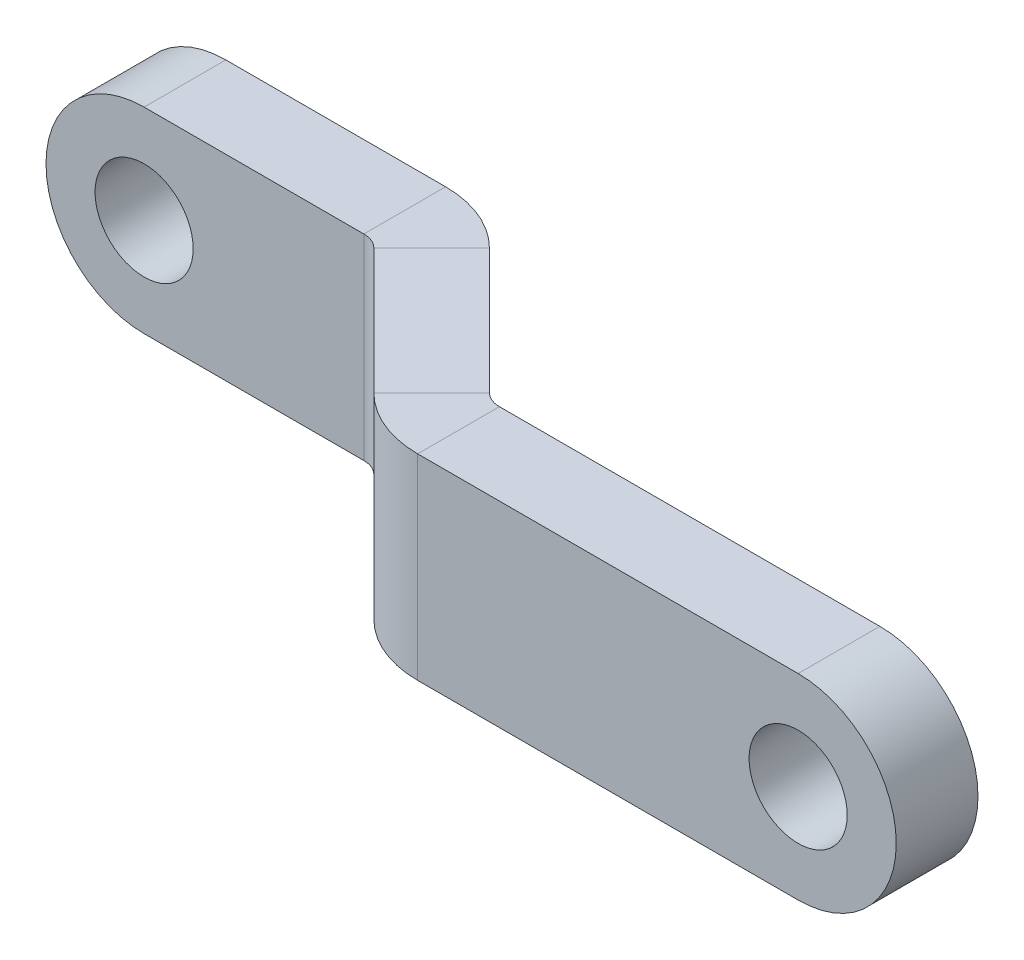
ISO-10303-21;
HEADER;
FILE_DESCRIPTION(('STEP AP214'),'2;1');
FILE_NAME('part.step','',(''),(''),'','','');
FILE_SCHEMA(('AUTOMOTIVE_DESIGN { 1 0 10303 214 1 1 1 1 }'));
ENDSEC;
DATA;
#1=APPLICATION_CONTEXT('core data for automotive mechanical design processes');
#2=APPLICATION_PROTOCOL_DEFINITION('international standard','automotive_design',2000,#1);
#3=PRODUCT_CONTEXT('',#1,'mechanical');
#4=PRODUCT('Part','Part','',(#3));
#5=PRODUCT_RELATED_PRODUCT_CATEGORY('part','',(#4));
#6=PRODUCT_DEFINITION_FORMATION('','',#4);
#7=PRODUCT_DEFINITION_CONTEXT('part definition',#1,'design');
#8=PRODUCT_DEFINITION('design','',#6,#7);
#9=PRODUCT_DEFINITION_SHAPE('','',#8);
#10=(LENGTH_UNIT() NAMED_UNIT(*) SI_UNIT(.MILLI.,.METRE.));
#11=(NAMED_UNIT(*) PLANE_ANGLE_UNIT() SI_UNIT($,.RADIAN.));
#12=(NAMED_UNIT(*) SI_UNIT($,.STERADIAN.) SOLID_ANGLE_UNIT());
#13=UNCERTAINTY_MEASURE_WITH_UNIT(LENGTH_MEASURE(1.E-05),#10,'distance_accuracy_value','');
#14=(GEOMETRIC_REPRESENTATION_CONTEXT(3) GLOBAL_UNCERTAINTY_ASSIGNED_CONTEXT((#13)) GLOBAL_UNIT_ASSIGNED_CONTEXT((#10,
#11,#12)) REPRESENTATION_CONTEXT('',''));
#15=CARTESIAN_POINT('',(0.,0.,0.));
#16=DIRECTION('',(0.,0.,1.));
#17=DIRECTION('',(1.,0.,0.));
#18=AXIS2_PLACEMENT_3D('',#15,#16,#17);
#19=CARTESIAN_POINT('',(1.38577854761114,0.,-5.63919516673022));
#20=DIRECTION('',(-0.707106781186549,0.,0.707106781186546));
#21=DIRECTION('',(0.707106781186546,0.,0.707106781186549));
#22=AXIS2_PLACEMENT_3D('',#19,#20,#21);
#23=PLANE('',#22);
#24=DIRECTION('',(0.707106781186546,0.,0.707106781186549));
#25=VECTOR('',#24,1.);
#26=CARTESIAN_POINT('',(1.38577854761114,-3.,-5.63919516673022));
#27=LINE('',#26,#25);
#28=CARTESIAN_POINT('',(7.24071885931933,-3.,0.21574514497799));
#29=VERTEX_POINT('',#28);
#30=CARTESIAN_POINT('',(11.0769955223297,-3.,4.05202180798839));
#31=VERTEX_POINT('',#30);
#32=EDGE_CURVE('E197',#29,#31,#27,.T.);
#33=ORIENTED_EDGE('',*,*,#32,.T.);
#34=DIRECTION('',(0.,1.,0.));
#35=VECTOR('',#34,1.);
#36=CARTESIAN_POINT('',(11.0769955223297,0.,4.05202180798839));
#37=LINE('',#36,#35);
#38=CARTESIAN_POINT('',(11.0769955223297,3.,4.0520218079884));
#39=VERTEX_POINT('',#38);
#40=EDGE_CURVE('E51',#31,#39,#37,.T.);
#41=ORIENTED_EDGE('',*,*,#40,.T.);
#42=DIRECTION('',(-0.707106781186546,0.,-0.707106781186549));
#43=VECTOR('',#42,1.);
#44=CARTESIAN_POINT('',(1.38577854761114,3.,-5.63919516673022));
#45=LINE('',#44,#43);
#46=CARTESIAN_POINT('',(7.24071885931932,3.,0.215745144977988));
#47=VERTEX_POINT('',#46);
#48=EDGE_CURVE('E67',#39,#47,#45,.T.);
#49=ORIENTED_EDGE('',*,*,#48,.T.);
#50=DIRECTION('',(0.,1.,0.));
#51=VECTOR('',#50,1.);
#52=CARTESIAN_POINT('',(7.24071885931933,0.,0.21574514497799));
#53=LINE('',#52,#51);
#54=EDGE_CURVE('E237',#29,#47,#53,.T.);
#55=ORIENTED_EDGE('',*,*,#54,.F.);
#56=EDGE_LOOP('',(#33,#41,#49,#55));
#57=FACE_BOUND('',#56,.T.);
#58=ADVANCED_FACE('F42',(#57),#23,.T.);
#59=CARTESIAN_POINT('',(3.15354550057751,-3.,-7.40696211969658));
#60=DIRECTION('',(0.,-1.,0.));
#61=DIRECTION('',(0.707106781186549,0.,-0.707106781186546));
#62=AXIS2_PLACEMENT_3D('',#59,#60,#61);
#63=PLANE('',#62);
#64=DIRECTION('',(0.707106781186546,0.,0.707106781186549));
#65=VECTOR('',#64,1.);
#66=CARTESIAN_POINT('',(3.15354550057751,-3.,-7.40696211969658));
#67=LINE('',#66,#65);
#68=CARTESIAN_POINT('',(9.0084858122857,-3.,-1.55202180798838));
#69=VERTEX_POINT('',#68);
#70=CARTESIAN_POINT('',(12.8447624752961,-3.,2.28425485502202));
#71=VERTEX_POINT('',#70);
#72=EDGE_CURVE('E249',#69,#71,#67,.T.);
#73=ORIENTED_EDGE('',*,*,#72,.T.);
#74=DIRECTION('',(-0.707106781186549,0.,0.707106781186546));
#75=VECTOR('',#74,1.);
#76=CARTESIAN_POINT('',(12.8447624752961,-3.,2.28425485502202));
#77=LINE('',#76,#75);
#78=EDGE_CURVE('E12',#71,#31,#77,.T.);
#79=ORIENTED_EDGE('',*,*,#78,.T.);
#80=ORIENTED_EDGE('',*,*,#32,.F.);
#81=DIRECTION('',(-0.707106781186549,0.,0.707106781186546));
#82=VECTOR('',#81,1.);
#83=CARTESIAN_POINT('',(9.0084858122857,-3.,-1.55202180798838));
#84=LINE('',#83,#82);
#85=EDGE_CURVE('E234',#69,#29,#84,.T.);
#86=ORIENTED_EDGE('',*,*,#85,.F.);
#87=EDGE_LOOP('',(#73,#79,#80,#86));
#88=FACE_BOUND('',#87,.T.);
#89=ADVANCED_FACE('F44',(#88),#63,.T.);
#90=CARTESIAN_POINT('',(3.15354550057751,3.,-7.40696211969658));
#91=DIRECTION('',(0.,1.,0.));
#92=DIRECTION('',(-0.707106781186549,0.,0.707106781186546));
#93=AXIS2_PLACEMENT_3D('',#90,#91,#92);
#94=PLANE('',#93);
#95=ORIENTED_EDGE('',*,*,#48,.F.);
#96=DIRECTION('',(0.707106781186549,0.,-0.707106781186546));
#97=VECTOR('',#96,1.);
#98=CARTESIAN_POINT('',(12.8447624752961,3.,2.28425485502202));
#99=LINE('',#98,#97);
#100=CARTESIAN_POINT('',(12.8447624752961,3.,2.28425485502202));
#101=VERTEX_POINT('',#100);
#102=EDGE_CURVE('E245',#39,#101,#99,.T.);
#103=ORIENTED_EDGE('',*,*,#102,.T.);
#104=DIRECTION('',(-0.707106781186546,0.,-0.707106781186549));
#105=VECTOR('',#104,1.);
#106=CARTESIAN_POINT('',(3.15354550057751,3.,-7.40696211969658));
#107=LINE('',#106,#105);
#108=CARTESIAN_POINT('',(9.00848581228569,3.,-1.55202180798838));
#109=VERTEX_POINT('',#108);
#110=EDGE_CURVE('E46',#101,#109,#107,.T.);
#111=ORIENTED_EDGE('',*,*,#110,.T.);
#112=DIRECTION('',(0.707106781186549,0.,-0.707106781186546));
#113=VECTOR('',#112,1.);
#114=CARTESIAN_POINT('',(9.0084858122857,3.,-1.55202180798838));
#115=LINE('',#114,#113);
#116=EDGE_CURVE('E240',#47,#109,#115,.T.);
#117=ORIENTED_EDGE('',*,*,#116,.F.);
#118=EDGE_LOOP('',(#95,#103,#111,#117));
#119=FACE_BOUND('',#118,.T.);
#120=ADVANCED_FACE('F268',(#119),#94,.T.);
#121=CARTESIAN_POINT('',(3.15354550057751,0.,-7.40696211969658));
#122=DIRECTION('',(-0.707106781186549,0.,0.707106781186546));
#123=DIRECTION('',(0.707106781186546,0.,0.707106781186549));
#124=AXIS2_PLACEMENT_3D('',#121,#122,#123);
#125=PLANE('',#124);
#126=DIRECTION('',(0.,1.,0.));
#127=VECTOR('',#126,1.);
#128=CARTESIAN_POINT('',(12.8447624752961,0.,2.28425485502202));
#129=LINE('',#128,#127);
#130=EDGE_CURVE('E243',#71,#101,#129,.T.);
#131=ORIENTED_EDGE('',*,*,#130,.F.);
#132=ORIENTED_EDGE('',*,*,#72,.F.);
#133=DIRECTION('',(0.,1.,0.));
#134=VECTOR('',#133,1.);
#135=CARTESIAN_POINT('',(9.0084858122857,0.,-1.55202180798838));
#136=LINE('',#135,#134);
#137=EDGE_CURVE('E232',#69,#109,#136,.T.);
#138=ORIENTED_EDGE('',*,*,#137,.T.);
#139=ORIENTED_EDGE('',*,*,#110,.F.);
#140=EDGE_LOOP('',(#131,#132,#138,#139));
#141=FACE_BOUND('',#140,.T.);
#142=ADVANCED_FACE('F264',(#141),#125,.F.);
#143=CARTESIAN_POINT('',(0.,0.,-2.5));
#144=DIRECTION('',(0.,0.,1.));
#145=DIRECTION('',(1.,0.,0.));
#146=AXIS2_PLACEMENT_3D('',#143,#144,#145);
#147=CYLINDRICAL_SURFACE('',#146,1.5);
#148=CARTESIAN_POINT('',(0.,0.,-2.5));
#149=DIRECTION('',(0.,0.,1.));
#150=DIRECTION('',(1.,0.,0.));
#151=AXIS2_PLACEMENT_3D('',#148,#149,#150);
#152=CIRCLE('',#151,1.5);
#153=CARTESIAN_POINT('',(1.5,0.,-2.5));
#154=VERTEX_POINT('',#153);
#155=EDGE_CURVE('E220',#154,#154,#152,.T.);
#156=ORIENTED_EDGE('',*,*,#155,.F.);
#157=EDGE_LOOP('',(#156));
#158=FACE_BOUND('',#157,.T.);
#159=CARTESIAN_POINT('',(0.,0.,0.));
#160=DIRECTION('',(0.,0.,1.));
#161=DIRECTION('',(1.,0.,0.));
#162=AXIS2_PLACEMENT_3D('',#159,#160,#161);
#163=CIRCLE('',#162,1.5);
#164=CARTESIAN_POINT('',(1.5,0.,0.));
#165=VERTEX_POINT('',#164);
#166=EDGE_CURVE('E228',#165,#165,#163,.T.);
#167=ORIENTED_EDGE('',*,*,#166,.T.);
#168=EDGE_LOOP('',(#167));
#169=FACE_BOUND('',#168,.T.);
#170=ADVANCED_FACE('F310',(#158,#169),#147,.F.);
#171=CARTESIAN_POINT('',(0.,0.,-2.5));
#172=DIRECTION('',(0.,0.,1.));
#173=DIRECTION('',(1.,0.,0.));
#174=AXIS2_PLACEMENT_3D('',#171,#172,#173);
#175=CYLINDRICAL_SURFACE('',#174,3.);
#176=CARTESIAN_POINT('',(0.,0.,0.));
#177=DIRECTION('',(0.,0.,1.));
#178=DIRECTION('',(1.,0.,0.));
#179=AXIS2_PLACEMENT_3D('',#176,#177,#178);
#180=CIRCLE('',#179,3.);
#181=CARTESIAN_POINT('',(0.,3.,0.));
#182=VERTEX_POINT('',#181);
#183=CARTESIAN_POINT('',(0.,-3.,0.));
#184=VERTEX_POINT('',#183);
#185=EDGE_CURVE('E203',#182,#184,#180,.T.);
#186=ORIENTED_EDGE('',*,*,#185,.F.);
#187=DIRECTION('',(0.,0.,1.));
#188=VECTOR('',#187,1.);
#189=CARTESIAN_POINT('',(0.,3.,-2.5));
#190=LINE('',#189,#188);
#191=CARTESIAN_POINT('',(0.,3.,-2.5));
#192=VERTEX_POINT('',#191);
#193=EDGE_CURVE('E194',#192,#182,#190,.T.);
#194=ORIENTED_EDGE('',*,*,#193,.F.);
#195=CARTESIAN_POINT('',(0.,0.,-2.5));
#196=DIRECTION('',(0.,0.,1.));
#197=DIRECTION('',(1.,0.,0.));
#198=AXIS2_PLACEMENT_3D('',#195,#196,#197);
#199=CIRCLE('',#198,3.);
#200=CARTESIAN_POINT('',(0.,-3.,-2.5));
#201=VERTEX_POINT('',#200);
#202=EDGE_CURVE('E225',#192,#201,#199,.T.);
#203=ORIENTED_EDGE('',*,*,#202,.T.);
#204=DIRECTION('',(0.,0.,1.));
#205=VECTOR('',#204,1.);
#206=CARTESIAN_POINT('',(0.,-3.,-2.5));
#207=LINE('',#206,#205);
#208=EDGE_CURVE('E223',#201,#184,#207,.T.);
#209=ORIENTED_EDGE('',*,*,#208,.T.);
#210=EDGE_LOOP('',(#186,#194,#203,#209));
#211=FACE_BOUND('',#210,.T.);
#212=ADVANCED_FACE('F327',(#211),#175,.T.);
#213=CARTESIAN_POINT('',(0.,0.,-2.5));
#214=DIRECTION('',(0.,0.,1.));
#215=DIRECTION('',(1.,0.,0.));
#216=AXIS2_PLACEMENT_3D('',#213,#214,#215);
#217=PLANE('',#216);
#218=DIRECTION('',(0.,1.,0.));
#219=VECTOR('',#218,1.);
#220=CARTESIAN_POINT('',(6.71986400429731,0.,-2.5));
#221=LINE('',#220,#219);
#222=CARTESIAN_POINT('',(6.71986400429731,-3.,-2.5));
#223=VERTEX_POINT('',#222);
#224=CARTESIAN_POINT('',(6.71986400429731,3.,-2.5));
#225=VERTEX_POINT('',#224);
#226=EDGE_CURVE('E190',#223,#225,#221,.T.);
#227=ORIENTED_EDGE('',*,*,#226,.F.);
#228=DIRECTION('',(1.,0.,0.));
#229=VECTOR('',#228,1.);
#230=CARTESIAN_POINT('',(0.,-3.,-2.5));
#231=LINE('',#230,#229);
#232=EDGE_CURVE('E217',#201,#223,#231,.T.);
#233=ORIENTED_EDGE('',*,*,#232,.F.);
#234=ORIENTED_EDGE('',*,*,#202,.F.);
#235=DIRECTION('',(-1.,0.,0.));
#236=VECTOR('',#235,1.);
#237=CARTESIAN_POINT('',(0.,3.,-2.5));
#238=LINE('',#237,#236);
#239=EDGE_CURVE('E198',#225,#192,#238,.T.);
#240=ORIENTED_EDGE('',*,*,#239,.F.);
#241=EDGE_LOOP('',(#227,#233,#234,#240));
#242=FACE_BOUND('',#241,.T.);
#243=ORIENTED_EDGE('',*,*,#155,.T.);
#244=EDGE_LOOP('',(#243));
#245=FACE_BOUND('',#244,.T.);
#246=ADVANCED_FACE('F323',(#242,#245),#217,.F.);
#247=CARTESIAN_POINT('',(0.,-3.,-2.5));
#248=DIRECTION('',(0.,-1.,0.));
#249=DIRECTION('',(0.,0.,-1.));
#250=AXIS2_PLACEMENT_3D('',#247,#248,#249);
#251=PLANE('',#250);
#252=ORIENTED_EDGE('',*,*,#232,.T.);
#253=DIRECTION('',(0.,0.,1.));
#254=VECTOR('',#253,1.);
#255=CARTESIAN_POINT('',(6.71986400429731,-3.,-2.5));
#256=LINE('',#255,#254);
#257=CARTESIAN_POINT('',(6.71986400429731,-3.,0.));
#258=VERTEX_POINT('',#257);
#259=EDGE_CURVE('E214',#223,#258,#256,.T.);
#260=ORIENTED_EDGE('',*,*,#259,.T.);
#261=DIRECTION('',(1.,0.,0.));
#262=VECTOR('',#261,1.);
#263=CARTESIAN_POINT('',(0.,-3.,0.));
#264=LINE('',#263,#262);
#265=EDGE_CURVE('E211',#184,#258,#264,.T.);
#266=ORIENTED_EDGE('',*,*,#265,.F.);
#267=ORIENTED_EDGE('',*,*,#208,.F.);
#268=EDGE_LOOP('',(#252,#260,#266,#267));
#269=FACE_BOUND('',#268,.T.);
#270=ADVANCED_FACE('F319',(#269),#251,.T.);
#271=CARTESIAN_POINT('',(0.,0.,0.));
#272=DIRECTION('',(0.,0.,1.));
#273=DIRECTION('',(1.,0.,0.));
#274=AXIS2_PLACEMENT_3D('',#271,#272,#273);
#275=PLANE('',#274);
#276=ORIENTED_EDGE('',*,*,#166,.F.);
#277=EDGE_LOOP('',(#276));
#278=FACE_BOUND('',#277,.T.);
#279=ORIENTED_EDGE('',*,*,#265,.T.);
#280=DIRECTION('',(0.,1.,0.));
#281=VECTOR('',#280,1.);
#282=CARTESIAN_POINT('',(6.71986400429731,0.,0.));
#283=LINE('',#282,#281);
#284=CARTESIAN_POINT('',(6.71986400429731,3.,0.));
#285=VERTEX_POINT('',#284);
#286=EDGE_CURVE('E208',#258,#285,#283,.T.);
#287=ORIENTED_EDGE('',*,*,#286,.T.);
#288=DIRECTION('',(-1.,0.,0.));
#289=VECTOR('',#288,1.);
#290=CARTESIAN_POINT('',(0.,3.,0.));
#291=LINE('',#290,#289);
#292=EDGE_CURVE('E206',#285,#182,#291,.T.);
#293=ORIENTED_EDGE('',*,*,#292,.T.);
#294=ORIENTED_EDGE('',*,*,#185,.T.);
#295=EDGE_LOOP('',(#279,#287,#293,#294));
#296=FACE_BOUND('',#295,.T.);
#297=ADVANCED_FACE('F315',(#278,#296),#275,.T.);
#298=CARTESIAN_POINT('',(0.,3.,-2.5));
#299=DIRECTION('',(0.,1.,0.));
#300=DIRECTION('',(0.,0.,1.));
#301=AXIS2_PLACEMENT_3D('',#298,#299,#300);
#302=PLANE('',#301);
#303=ORIENTED_EDGE('',*,*,#292,.F.);
#304=DIRECTION('',(0.,0.,-1.));
#305=VECTOR('',#304,1.);
#306=CARTESIAN_POINT('',(6.71986400429731,3.,-2.5));
#307=LINE('',#306,#305);
#308=EDGE_CURVE('E200',#285,#225,#307,.T.);
#309=ORIENTED_EDGE('',*,*,#308,.T.);
#310=ORIENTED_EDGE('',*,*,#239,.T.);
#311=ORIENTED_EDGE('',*,*,#193,.T.);
#312=EDGE_LOOP('',(#303,#309,#310,#311));
#313=FACE_BOUND('',#312,.T.);
#314=ADVANCED_FACE('F311',(#313),#302,.T.);
#315=CARTESIAN_POINT('',(6.71986400429731,-3.,0.7366));
#316=DIRECTION('',(0.,-1.,0.));
#317=DIRECTION('',(0.,0.,-1.));
#318=AXIS2_PLACEMENT_3D('',#315,#316,#317);
#319=PLANE('',#318);
#320=ORIENTED_EDGE('',*,*,#85,.T.);
#321=CARTESIAN_POINT('',(6.71986400429731,-3.,0.7366));
#322=DIRECTION('',(0.,-1.,0.));
#323=DIRECTION('',(1.,0.,0.));
#324=AXIS2_PLACEMENT_3D('',#321,#322,#323);
#325=CIRCLE('',#324,0.7366);
#326=EDGE_CURVE('E179',#29,#258,#325,.F.);
#327=ORIENTED_EDGE('',*,*,#326,.T.);
#328=ORIENTED_EDGE('',*,*,#259,.F.);
#329=CARTESIAN_POINT('',(6.71986400429731,-3.,0.7366));
#330=DIRECTION('',(0.,1.,0.));
#331=DIRECTION('',(0.,0.,-1.));
#332=AXIS2_PLACEMENT_3D('',#329,#330,#331);
#333=CIRCLE('',#332,3.2366);
#334=EDGE_CURVE('E183',#69,#223,#333,.T.);
#335=ORIENTED_EDGE('',*,*,#334,.F.);
#336=EDGE_LOOP('',(#320,#327,#328,#335));
#337=FACE_BOUND('',#336,.T.);
#338=ADVANCED_FACE('F314',(#337),#319,.T.);
#339=CARTESIAN_POINT('',(6.71986400429731,3.,0.7366));
#340=DIRECTION('',(0.,1.,0.));
#341=DIRECTION('',(0.,0.,1.));
#342=AXIS2_PLACEMENT_3D('',#339,#340,#341);
#343=PLANE('',#342);
#344=ORIENTED_EDGE('',*,*,#308,.F.);
#345=CARTESIAN_POINT('',(6.71986400429731,3.,0.7366));
#346=DIRECTION('',(0.,-1.,0.));
#347=DIRECTION('',(1.,0.,0.));
#348=AXIS2_PLACEMENT_3D('',#345,#346,#347);
#349=CIRCLE('',#348,0.7366);
#350=EDGE_CURVE('E187',#285,#47,#349,.T.);
#351=ORIENTED_EDGE('',*,*,#350,.T.);
#352=ORIENTED_EDGE('',*,*,#116,.T.);
#353=CARTESIAN_POINT('',(6.71986400429731,3.,0.7366));
#354=DIRECTION('',(0.,-1.,0.));
#355=DIRECTION('',(0.,0.,1.));
#356=AXIS2_PLACEMENT_3D('',#353,#354,#355);
#357=CIRCLE('',#356,3.2366);
#358=EDGE_CURVE('E186',#225,#109,#357,.T.);
#359=ORIENTED_EDGE('',*,*,#358,.F.);
#360=EDGE_LOOP('',(#344,#351,#352,#359));
#361=FACE_BOUND('',#360,.T.);
#362=ADVANCED_FACE('F337',(#361),#343,.T.);
#363=CARTESIAN_POINT('',(6.71986400429731,6.68464274940435,0.7366));
#364=DIRECTION('',(0.,-1.,0.));
#365=DIRECTION('',(1.,0.,0.));
#366=AXIS2_PLACEMENT_3D('',#363,#364,#365);
#367=CYLINDRICAL_SURFACE('',#366,3.2366);
#368=ORIENTED_EDGE('',*,*,#358,.T.);
#369=ORIENTED_EDGE('',*,*,#137,.F.);
#370=ORIENTED_EDGE('',*,*,#334,.T.);
#371=ORIENTED_EDGE('',*,*,#226,.T.);
#372=EDGE_LOOP('',(#368,#369,#370,#371));
#373=FACE_BOUND('',#372,.T.);
#374=ADVANCED_FACE('F341',(#373),#367,.T.);
#375=CARTESIAN_POINT('',(6.71986400429731,6.68464274940435,0.7366));
#376=DIRECTION('',(0.,-1.,0.));
#377=DIRECTION('',(1.,0.,0.));
#378=AXIS2_PLACEMENT_3D('',#375,#376,#377);
#379=CYLINDRICAL_SURFACE('',#378,0.7366);
#380=ORIENTED_EDGE('',*,*,#350,.F.);
#381=ORIENTED_EDGE('',*,*,#286,.F.);
#382=ORIENTED_EDGE('',*,*,#326,.F.);
#383=ORIENTED_EDGE('',*,*,#54,.T.);
#384=EDGE_LOOP('',(#380,#381,#382,#383));
#385=FACE_BOUND('',#384,.T.);
#386=ADVANCED_FACE('F343',(#385),#379,.F.);
#387=CARTESIAN_POINT('',(13.3656173303181,-3.,1.76340000000001));
#388=DIRECTION('',(0.,1.,0.));
#389=DIRECTION('',(0.,0.,1.));
#390=AXIS2_PLACEMENT_3D('',#387,#388,#389);
#391=PLANE('',#390);
#392=DIRECTION('',(0.,0.,1.));
#393=VECTOR('',#392,1.);
#394=CARTESIAN_POINT('',(13.3656173303181,-3.,2.50000000000001));
#395=LINE('',#394,#393);
#396=CARTESIAN_POINT('',(13.3656173303181,-3.,2.50000000000001));
#397=VERTEX_POINT('',#396);
#398=CARTESIAN_POINT('',(13.3656173303181,-3.,5.00000000000001));
#399=VERTEX_POINT('',#398);
#400=EDGE_CURVE('E141',#397,#399,#395,.T.);
#401=ORIENTED_EDGE('',*,*,#400,.T.);
#402=CARTESIAN_POINT('',(13.3656173303181,-3.,1.76340000000001));
#403=DIRECTION('',(0.,-1.,0.));
#404=DIRECTION('',(1.,0.,0.));
#405=AXIS2_PLACEMENT_3D('',#402,#403,#404);
#406=CIRCLE('',#405,3.2366);
#407=EDGE_CURVE('E59',#399,#31,#406,.T.);
#408=ORIENTED_EDGE('',*,*,#407,.T.);
#409=ORIENTED_EDGE('',*,*,#78,.F.);
#410=CARTESIAN_POINT('',(13.3656173303181,-3.,1.76340000000001));
#411=DIRECTION('',(0.,-1.,0.));
#412=DIRECTION('',(0.,0.,1.));
#413=AXIS2_PLACEMENT_3D('',#410,#411,#412);
#414=CIRCLE('',#413,0.736600000000001);
#415=EDGE_CURVE('E172',#397,#71,#414,.T.);
#416=ORIENTED_EDGE('',*,*,#415,.F.);
#417=EDGE_LOOP('',(#401,#408,#409,#416));
#418=FACE_BOUND('',#417,.T.);
#419=ADVANCED_FACE('F255',(#418),#391,.F.);
#420=CARTESIAN_POINT('',(13.3656173303181,3.,1.76340000000001));
#421=DIRECTION('',(0.,-1.,0.));
#422=DIRECTION('',(0.,0.,-1.));
#423=AXIS2_PLACEMENT_3D('',#420,#421,#422);
#424=PLANE('',#423);
#425=ORIENTED_EDGE('',*,*,#102,.F.);
#426=CARTESIAN_POINT('',(13.3656173303181,3.,1.76340000000001));
#427=DIRECTION('',(0.,-1.,0.));
#428=DIRECTION('',(1.,0.,0.));
#429=AXIS2_PLACEMENT_3D('',#426,#427,#428);
#430=CIRCLE('',#429,3.2366);
#431=CARTESIAN_POINT('',(13.3656173303181,3.,5.00000000000001));
#432=VERTEX_POINT('',#431);
#433=EDGE_CURVE('E176',#39,#432,#430,.F.);
#434=ORIENTED_EDGE('',*,*,#433,.T.);
#435=DIRECTION('',(0.,0.,-1.));
#436=VECTOR('',#435,1.);
#437=CARTESIAN_POINT('',(13.3656173303181,3.,2.50000000000001));
#438=LINE('',#437,#436);
#439=CARTESIAN_POINT('',(13.3656173303181,3.,2.50000000000001));
#440=VERTEX_POINT('',#439);
#441=EDGE_CURVE('E160',#432,#440,#438,.T.);
#442=ORIENTED_EDGE('',*,*,#441,.T.);
#443=CARTESIAN_POINT('',(13.3656173303181,3.,1.76340000000001));
#444=DIRECTION('',(0.,1.,0.));
#445=DIRECTION('',(0.,0.,-1.));
#446=AXIS2_PLACEMENT_3D('',#443,#444,#445);
#447=CIRCLE('',#446,0.7366);
#448=EDGE_CURVE('E175',#101,#440,#447,.T.);
#449=ORIENTED_EDGE('',*,*,#448,.F.);
#450=EDGE_LOOP('',(#425,#434,#442,#449));
#451=FACE_BOUND('',#450,.T.);
#452=ADVANCED_FACE('F271',(#451),#424,.F.);
#453=CARTESIAN_POINT('',(13.3656173303181,7.24470901031856,1.76340000000001));
#454=DIRECTION('',(0.,-1.,0.));
#455=DIRECTION('',(1.,0.,0.));
#456=AXIS2_PLACEMENT_3D('',#453,#454,#455);
#457=CYLINDRICAL_SURFACE('',#456,0.7366);
#458=ORIENTED_EDGE('',*,*,#448,.T.);
#459=DIRECTION('',(0.,1.,0.));
#460=VECTOR('',#459,1.);
#461=CARTESIAN_POINT('',(13.3656173303181,0.,2.50000000000001));
#462=LINE('',#461,#460);
#463=EDGE_CURVE('E261',#397,#440,#462,.T.);
#464=ORIENTED_EDGE('',*,*,#463,.F.);
#465=ORIENTED_EDGE('',*,*,#415,.T.);
#466=ORIENTED_EDGE('',*,*,#130,.T.);
#467=EDGE_LOOP('',(#458,#464,#465,#466));
#468=FACE_BOUND('',#467,.T.);
#469=ADVANCED_FACE('F259',(#468),#457,.F.);
#470=CARTESIAN_POINT('',(13.3656173303181,7.24470901031856,1.76340000000001));
#471=DIRECTION('',(0.,-1.,0.));
#472=DIRECTION('',(1.,0.,0.));
#473=AXIS2_PLACEMENT_3D('',#470,#471,#472);
#474=CYLINDRICAL_SURFACE('',#473,3.2366);
#475=ORIENTED_EDGE('',*,*,#433,.F.);
#476=ORIENTED_EDGE('',*,*,#40,.F.);
#477=ORIENTED_EDGE('',*,*,#407,.F.);
#478=DIRECTION('',(0.,1.,0.));
#479=VECTOR('',#478,1.);
#480=CARTESIAN_POINT('',(13.3656173303181,0.,5.00000000000001));
#481=LINE('',#480,#479);
#482=EDGE_CURVE('E165',#399,#432,#481,.T.);
#483=ORIENTED_EDGE('',*,*,#482,.T.);
#484=EDGE_LOOP('',(#475,#476,#477,#483));
#485=FACE_BOUND('',#484,.T.);
#486=ADVANCED_FACE('F273',(#485),#474,.T.);
#487=CARTESIAN_POINT('',(25.,0.,2.50000000000001));
#488=DIRECTION('',(0.,0.,1.));
#489=DIRECTION('',(1.,0.,0.));
#490=AXIS2_PLACEMENT_3D('',#487,#488,#489);
#491=CYLINDRICAL_SURFACE('',#490,3.);
#492=CARTESIAN_POINT('',(25.,0.,5.00000000000001));
#493=DIRECTION('',(0.,0.,1.));
#494=DIRECTION('',(1.,0.,0.));
#495=AXIS2_PLACEMENT_3D('',#492,#493,#494);
#496=CIRCLE('',#495,3.);
#497=CARTESIAN_POINT('',(25.,-3.,5.00000000000001));
#498=VERTEX_POINT('',#497);
#499=CARTESIAN_POINT('',(25.,3.,5.00000000000001));
#500=VERTEX_POINT('',#499);
#501=EDGE_CURVE('E154',#498,#500,#496,.T.);
#502=ORIENTED_EDGE('',*,*,#501,.F.);
#503=DIRECTION('',(0.,0.,1.));
#504=VECTOR('',#503,1.);
#505=CARTESIAN_POINT('',(25.,-3.,2.50000000000001));
#506=LINE('',#505,#504);
#507=CARTESIAN_POINT('',(25.,-3.,2.50000000000001));
#508=VERTEX_POINT('',#507);
#509=EDGE_CURVE('E139',#508,#498,#506,.T.);
#510=ORIENTED_EDGE('',*,*,#509,.F.);
#511=CARTESIAN_POINT('',(25.,0.,2.50000000000001));
#512=DIRECTION('',(0.,0.,1.));
#513=DIRECTION('',(1.,0.,0.));
#514=AXIS2_PLACEMENT_3D('',#511,#512,#513);
#515=CIRCLE('',#514,3.);
#516=CARTESIAN_POINT('',(25.,3.,2.50000000000001));
#517=VERTEX_POINT('',#516);
#518=EDGE_CURVE('E152',#508,#517,#515,.T.);
#519=ORIENTED_EDGE('',*,*,#518,.T.);
#520=DIRECTION('',(0.,0.,1.));
#521=VECTOR('',#520,1.);
#522=CARTESIAN_POINT('',(25.,3.,2.50000000000001));
#523=LINE('',#522,#521);
#524=EDGE_CURVE('E159',#517,#500,#523,.T.);
#525=ORIENTED_EDGE('',*,*,#524,.T.);
#526=EDGE_LOOP('',(#502,#510,#519,#525));
#527=FACE_BOUND('',#526,.T.);
#528=ADVANCED_FACE('F150',(#527),#491,.T.);
#529=CARTESIAN_POINT('',(25.,0.,2.50000000000001));
#530=DIRECTION('',(0.,0.,1.));
#531=DIRECTION('',(1.,0.,0.));
#532=AXIS2_PLACEMENT_3D('',#529,#530,#531);
#533=CYLINDRICAL_SURFACE('',#532,1.5);
#534=CARTESIAN_POINT('',(25.,0.,2.50000000000001));
#535=DIRECTION('',(0.,0.,1.));
#536=DIRECTION('',(1.,0.,0.));
#537=AXIS2_PLACEMENT_3D('',#534,#535,#536);
#538=CIRCLE('',#537,1.5);
#539=CARTESIAN_POINT('',(26.5,0.,2.50000000000001));
#540=VERTEX_POINT('',#539);
#541=EDGE_CURVE('E284',#540,#540,#538,.T.);
#542=ORIENTED_EDGE('',*,*,#541,.F.);
#543=EDGE_LOOP('',(#542));
#544=FACE_BOUND('',#543,.T.);
#545=CARTESIAN_POINT('',(25.,0.,5.00000000000001));
#546=DIRECTION('',(0.,0.,1.));
#547=DIRECTION('',(1.,0.,0.));
#548=AXIS2_PLACEMENT_3D('',#545,#546,#547);
#549=CIRCLE('',#548,1.5);
#550=CARTESIAN_POINT('',(26.5,0.,5.00000000000001));
#551=VERTEX_POINT('',#550);
#552=EDGE_CURVE('E162',#551,#551,#549,.T.);
#553=ORIENTED_EDGE('',*,*,#552,.T.);
#554=EDGE_LOOP('',(#553));
#555=FACE_BOUND('',#554,.T.);
#556=ADVANCED_FACE('F292',(#544,#555),#533,.F.);
#557=CARTESIAN_POINT('',(-1.90010514263466,0.,2.50000000000001));
#558=DIRECTION('',(0.,0.,1.));
#559=DIRECTION('',(1.,0.,0.));
#560=AXIS2_PLACEMENT_3D('',#557,#558,#559);
#561=PLANE('',#560);
#562=ORIENTED_EDGE('',*,*,#541,.T.);
#563=EDGE_LOOP('',(#562));
#564=FACE_BOUND('',#563,.T.);
#565=DIRECTION('',(1.,0.,0.));
#566=VECTOR('',#565,1.);
#567=CARTESIAN_POINT('',(-1.90010514263466,-3.,2.50000000000001));
#568=LINE('',#567,#566);
#569=EDGE_CURVE('E136',#397,#508,#568,.T.);
#570=ORIENTED_EDGE('',*,*,#569,.F.);
#571=ORIENTED_EDGE('',*,*,#463,.T.);
#572=DIRECTION('',(-1.,0.,0.));
#573=VECTOR('',#572,1.);
#574=CARTESIAN_POINT('',(-1.90010514263466,3.,2.50000000000001));
#575=LINE('',#574,#573);
#576=EDGE_CURVE('E157',#517,#440,#575,.T.);
#577=ORIENTED_EDGE('',*,*,#576,.F.);
#578=ORIENTED_EDGE('',*,*,#518,.F.);
#579=EDGE_LOOP('',(#570,#571,#577,#578));
#580=FACE_BOUND('',#579,.T.);
#581=ADVANCED_FACE('F156',(#564,#580),#561,.F.);
#582=CARTESIAN_POINT('',(-1.90010514263466,3.,2.50000000000001));
#583=DIRECTION('',(0.,1.,0.));
#584=DIRECTION('',(0.,0.,1.));
#585=AXIS2_PLACEMENT_3D('',#582,#583,#584);
#586=PLANE('',#585);
#587=ORIENTED_EDGE('',*,*,#441,.F.);
#588=DIRECTION('',(-1.,0.,0.));
#589=VECTOR('',#588,1.);
#590=CARTESIAN_POINT('',(-1.90010514263466,3.,5.00000000000001));
#591=LINE('',#590,#589);
#592=EDGE_CURVE('E146',#500,#432,#591,.T.);
#593=ORIENTED_EDGE('',*,*,#592,.F.);
#594=ORIENTED_EDGE('',*,*,#524,.F.);
#595=ORIENTED_EDGE('',*,*,#576,.T.);
#596=EDGE_LOOP('',(#587,#593,#594,#595));
#597=FACE_BOUND('',#596,.T.);
#598=ADVANCED_FACE('F282',(#597),#586,.T.);
#599=CARTESIAN_POINT('',(-1.90010514263466,0.,5.00000000000001));
#600=DIRECTION('',(0.,0.,1.));
#601=DIRECTION('',(1.,0.,0.));
#602=AXIS2_PLACEMENT_3D('',#599,#600,#601);
#603=PLANE('',#602);
#604=ORIENTED_EDGE('',*,*,#482,.F.);
#605=DIRECTION('',(1.,0.,0.));
#606=VECTOR('',#605,1.);
#607=CARTESIAN_POINT('',(-1.90010514263466,-3.,5.00000000000001));
#608=LINE('',#607,#606);
#609=EDGE_CURVE('E278',#399,#498,#608,.T.);
#610=ORIENTED_EDGE('',*,*,#609,.T.);
#611=ORIENTED_EDGE('',*,*,#501,.T.);
#612=ORIENTED_EDGE('',*,*,#592,.T.);
#613=EDGE_LOOP('',(#604,#610,#611,#612));
#614=FACE_BOUND('',#613,.T.);
#615=ORIENTED_EDGE('',*,*,#552,.F.);
#616=EDGE_LOOP('',(#615));
#617=FACE_BOUND('',#616,.T.);
#618=ADVANCED_FACE('F276',(#614,#617),#603,.T.);
#619=CARTESIAN_POINT('',(-1.90010514263466,-3.,2.50000000000001));
#620=DIRECTION('',(0.,-1.,0.));
#621=DIRECTION('',(0.,0.,-1.));
#622=AXIS2_PLACEMENT_3D('',#619,#620,#621);
#623=PLANE('',#622);
#624=ORIENTED_EDGE('',*,*,#400,.F.);
#625=ORIENTED_EDGE('',*,*,#569,.T.);
#626=ORIENTED_EDGE('',*,*,#509,.T.);
#627=ORIENTED_EDGE('',*,*,#609,.F.);
#628=EDGE_LOOP('',(#624,#625,#626,#627));
#629=FACE_BOUND('',#628,.T.);
#630=ADVANCED_FACE('F138',(#629),#623,.T.);
#631=CLOSED_SHELL('',(#58,#89,#120,#142,#170,#212,#246,#270,#297,#314,#338,#362,#374,#386,#419,
#452,#469,#486,#528,#556,#581,#598,#618,#630));
#632=MANIFOLD_SOLID_BREP('B2',#631);
#633=ADVANCED_BREP_SHAPE_REPRESENTATION('',(#18,#632),#14);
#634=SHAPE_DEFINITION_REPRESENTATION(#9,#633);
ENDSEC;
END-ISO-10303-21;
